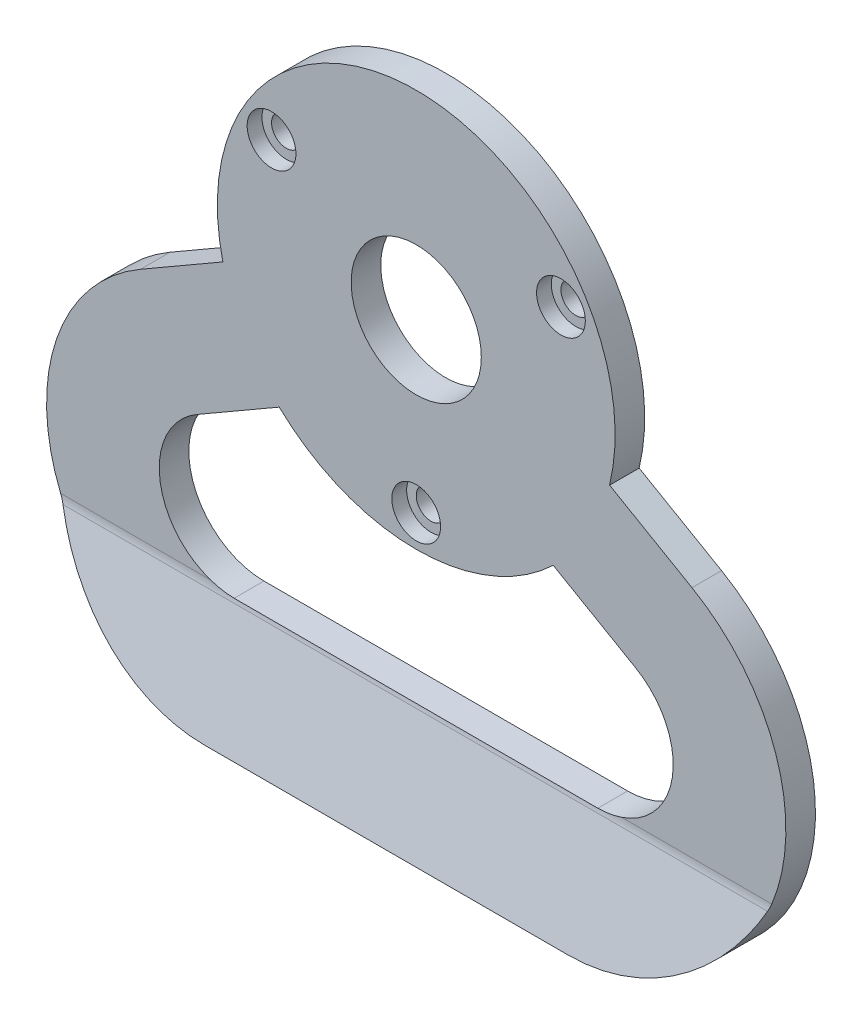
ISO-10303-21;
HEADER;
FILE_DESCRIPTION(('STEP AP214'),'2;1');
FILE_NAME('part.step','',(''),(''),'','','');
FILE_SCHEMA(('AUTOMOTIVE_DESIGN { 1 0 10303 214 1 1 1 1 }'));
ENDSEC;
DATA;
#1=APPLICATION_CONTEXT('core data for automotive mechanical design processes');
#2=APPLICATION_PROTOCOL_DEFINITION('international standard','automotive_design',2000,#1);
#3=PRODUCT_CONTEXT('',#1,'mechanical');
#4=PRODUCT('Part','Part','',(#3));
#5=PRODUCT_RELATED_PRODUCT_CATEGORY('part','',(#4));
#6=PRODUCT_DEFINITION_FORMATION('','',#4);
#7=PRODUCT_DEFINITION_CONTEXT('part definition',#1,'design');
#8=PRODUCT_DEFINITION('design','',#6,#7);
#9=PRODUCT_DEFINITION_SHAPE('','',#8);
#10=(LENGTH_UNIT() NAMED_UNIT(*) SI_UNIT(.MILLI.,.METRE.));
#11=(NAMED_UNIT(*) PLANE_ANGLE_UNIT() SI_UNIT($,.RADIAN.));
#12=(NAMED_UNIT(*) SI_UNIT($,.STERADIAN.) SOLID_ANGLE_UNIT());
#13=UNCERTAINTY_MEASURE_WITH_UNIT(LENGTH_MEASURE(1.E-05),#10,'distance_accuracy_value','');
#14=(GEOMETRIC_REPRESENTATION_CONTEXT(3) GLOBAL_UNCERTAINTY_ASSIGNED_CONTEXT((#13)) GLOBAL_UNIT_ASSIGNED_CONTEXT((#10,
#11,#12)) REPRESENTATION_CONTEXT('',''));
#15=CARTESIAN_POINT('',(0.,0.,0.));
#16=DIRECTION('',(0.,0.,1.));
#17=DIRECTION('',(1.,0.,0.));
#18=AXIS2_PLACEMENT_3D('',#15,#16,#17);
#19=CARTESIAN_POINT('',(0.,-75.1775588832577,5.));
#20=DIRECTION('',(0.,1.,0.));
#21=DIRECTION('',(0.,0.,1.));
#22=AXIS2_PLACEMENT_3D('',#19,#20,#21);
#23=PLANE('',#22);
#24=DIRECTION('',(0.,0.,-1.));
#25=VECTOR('',#24,1.);
#26=CARTESIAN_POINT('',(30.7422046406712,-75.1775588832577,5.));
#27=LINE('',#26,#25);
#28=CARTESIAN_POINT('',(30.7422046406712,-75.1775588832576,10.));
#29=VERTEX_POINT('',#28);
#30=CARTESIAN_POINT('',(30.7422046406712,-75.1775588832577,0.));
#31=VERTEX_POINT('',#30);
#32=EDGE_CURVE('E149',#29,#31,#27,.T.);
#33=ORIENTED_EDGE('',*,*,#32,.F.);
#34=DIRECTION('',(1.,0.,0.));
#35=VECTOR('',#34,1.);
#36=CARTESIAN_POINT('',(-62.5,-75.1775588832576,10.));
#37=LINE('',#36,#35);
#38=CARTESIAN_POINT('',(-30.7422046406712,-75.1775588832576,10.));
#39=VERTEX_POINT('',#38);
#40=EDGE_CURVE('E162',#39,#29,#37,.T.);
#41=ORIENTED_EDGE('',*,*,#40,.F.);
#42=DIRECTION('',(0.,0.,-1.));
#43=VECTOR('',#42,1.);
#44=CARTESIAN_POINT('',(-30.7422046406712,-75.1775588832576,5.));
#45=LINE('',#44,#43);
#46=CARTESIAN_POINT('',(-30.7422046406712,-75.1775588832576,0.));
#47=VERTEX_POINT('',#46);
#48=EDGE_CURVE('E192',#39,#47,#45,.T.);
#49=ORIENTED_EDGE('',*,*,#48,.T.);
#50=DIRECTION('',(1.,0.,0.));
#51=VECTOR('',#50,1.);
#52=CARTESIAN_POINT('',(0.,-75.1775588832577,0.));
#53=LINE('',#52,#51);
#54=EDGE_CURVE('E164',#47,#31,#53,.T.);
#55=ORIENTED_EDGE('',*,*,#54,.T.);
#56=EDGE_LOOP('',(#33,#41,#49,#55));
#57=FACE_BOUND('',#56,.T.);
#58=ADVANCED_FACE('F33',(#57),#23,.F.);
#59=CARTESIAN_POINT('',(0.,0.,5.));
#60=DIRECTION('',(0.,0.,1.));
#61=DIRECTION('',(1.,0.,0.));
#62=AXIS2_PLACEMENT_3D('',#59,#60,#61);
#63=PLANE('',#62);
#64=CARTESIAN_POINT('',(0.,0.,5.));
#65=DIRECTION('',(0.,0.,1.));
#66=DIRECTION('',(1.,0.,0.));
#67=AXIS2_PLACEMENT_3D('',#64,#65,#66);
#68=CIRCLE('',#67,11.);
#69=CARTESIAN_POINT('',(11.,0.,5.));
#70=VERTEX_POINT('',#69);
#71=EDGE_CURVE('E267',#70,#70,#68,.T.);
#72=ORIENTED_EDGE('',*,*,#71,.F.);
#73=EDGE_LOOP('',(#72));
#74=FACE_BOUND('',#73,.T.);
#75=CARTESIAN_POINT('',(-24.4652176569104,14.1249999999999,5.));
#76=DIRECTION('',(0.,0.,1.));
#77=DIRECTION('',(1.,0.,0.));
#78=AXIS2_PLACEMENT_3D('',#75,#76,#77);
#79=CIRCLE('',#78,4.125);
#80=CARTESIAN_POINT('',(-20.3402176569104,14.1249999999999,5.));
#81=VERTEX_POINT('',#80);
#82=EDGE_CURVE('E242',#81,#81,#79,.T.);
#83=ORIENTED_EDGE('',*,*,#82,.F.);
#84=EDGE_LOOP('',(#83));
#85=FACE_BOUND('',#84,.T.);
#86=CARTESIAN_POINT('',(24.4652176569103,14.1250000000001,5.));
#87=DIRECTION('',(0.,0.,1.));
#88=DIRECTION('',(1.,0.,0.));
#89=AXIS2_PLACEMENT_3D('',#86,#87,#88);
#90=CIRCLE('',#89,4.125);
#91=CARTESIAN_POINT('',(28.5902176569103,14.1250000000001,5.));
#92=VERTEX_POINT('',#91);
#93=EDGE_CURVE('E248',#92,#92,#90,.T.);
#94=ORIENTED_EDGE('',*,*,#93,.F.);
#95=EDGE_LOOP('',(#94));
#96=FACE_BOUND('',#95,.T.);
#97=CARTESIAN_POINT('',(0.,-28.25,5.));
#98=DIRECTION('',(0.,0.,1.));
#99=DIRECTION('',(1.,0.,0.));
#100=AXIS2_PLACEMENT_3D('',#97,#98,#99);
#101=CIRCLE('',#100,4.125);
#102=CARTESIAN_POINT('',(4.125,-28.25,5.));
#103=VERTEX_POINT('',#102);
#104=EDGE_CURVE('E237',#103,#103,#101,.T.);
#105=ORIENTED_EDGE('',*,*,#104,.F.);
#106=EDGE_LOOP('',(#105));
#107=FACE_BOUND('',#106,.T.);
#108=CARTESIAN_POINT('',(-30.7422046406712,-43.4197635239289,5.));
#109=DIRECTION('',(0.,0.,1.));
#110=DIRECTION('',(1.,0.,0.));
#111=AXIS2_PLACEMENT_3D('',#108,#109,#110);
#112=CIRCLE('',#111,31.7577953593288);
#113=CARTESIAN_POINT('',(-46.6211023203356,-15.9167059745627,5.));
#114=VERTEX_POINT('',#113);
#115=CARTESIAN_POINT('',(-60.1209732052363,-55.4798432796655,5.));
#116=VERTEX_POINT('',#115);
#117=EDGE_CURVE('E224',#114,#116,#112,.T.);
#118=ORIENTED_EDGE('',*,*,#117,.T.);
#119=DIRECTION('',(1.,0.,0.));
#120=VECTOR('',#119,1.);
#121=CARTESIAN_POINT('',(-30.7422046406712,-55.4798432796655,5.));
#122=LINE('',#121,#120);
#123=CARTESIAN_POINT('',(-34.7393924268729,-55.4798432796655,5.));
#124=VERTEX_POINT('',#123);
#125=EDGE_CURVE('E292',#116,#124,#122,.T.);
#126=ORIENTED_EDGE('',*,*,#125,.T.);
#127=CARTESIAN_POINT('',(-30.7422046406712,-43.4197635239289,5.));
#128=DIRECTION('',(0.,0.,1.));
#129=DIRECTION('',(1.,0.,0.));
#130=AXIS2_PLACEMENT_3D('',#127,#128,#129);
#131=CIRCLE('',#130,12.7052364760711);
#132=CARTESIAN_POINT('',(-37.0948228787067,-32.4167059745627,5.));
#133=VERTEX_POINT('',#132);
#134=EDGE_CURVE('E187',#133,#124,#131,.T.);
#135=ORIENTED_EDGE('',*,*,#134,.F.);
#136=DIRECTION('',(0.86602540378444,0.499999999999998,0.));
#137=VECTOR('',#136,1.);
#138=CARTESIAN_POINT('',(4.7631397208144,-8.25000000000002,5.));
#139=LINE('',#138,#137);
#140=CARTESIAN_POINT('',(-23.1638717331526,-24.3736675806095,5.));
#141=VERTEX_POINT('',#140);
#142=EDGE_CURVE('E228',#133,#141,#139,.T.);
#143=ORIENTED_EDGE('',*,*,#142,.T.);
#144=CARTESIAN_POINT('',(0.,0.,5.));
#145=DIRECTION('',(0.,0.,1.));
#146=DIRECTION('',(1.,0.,0.));
#147=AXIS2_PLACEMENT_3D('',#144,#145,#146);
#148=CIRCLE('',#147,33.625);
#149=CARTESIAN_POINT('',(23.1638717331526,-24.3736675806095,5.));
#150=VERTEX_POINT('',#149);
#151=EDGE_CURVE('E273',#141,#150,#148,.T.);
#152=ORIENTED_EDGE('',*,*,#151,.T.);
#153=DIRECTION('',(0.86602540378444,-0.499999999999998,0.));
#154=VECTOR('',#153,1.);
#155=CARTESIAN_POINT('',(-4.7631397208144,-8.25000000000003,5.));
#156=LINE('',#155,#154);
#157=CARTESIAN_POINT('',(37.0948228787068,-32.4167059745627,5.));
#158=VERTEX_POINT('',#157);
#159=EDGE_CURVE('E198',#150,#158,#156,.T.);
#160=ORIENTED_EDGE('',*,*,#159,.T.);
#161=CARTESIAN_POINT('',(30.7422046406712,-43.4197635239289,5.));
#162=DIRECTION('',(0.,0.,1.));
#163=DIRECTION('',(1.,0.,0.));
#164=AXIS2_PLACEMENT_3D('',#161,#162,#163);
#165=CIRCLE('',#164,12.7052364760711);
#166=CARTESIAN_POINT('',(34.7393924268729,-55.4798432796655,5.));
#167=VERTEX_POINT('',#166);
#168=EDGE_CURVE('E175',#167,#158,#165,.T.);
#169=ORIENTED_EDGE('',*,*,#168,.F.);
#170=DIRECTION('',(-1.,0.,0.));
#171=VECTOR('',#170,1.);
#172=CARTESIAN_POINT('',(47.4301828160546,-55.4798432796655,5.));
#173=LINE('',#172,#171);
#174=CARTESIAN_POINT('',(60.1209732052363,-55.4798432796655,5.));
#175=VERTEX_POINT('',#174);
#176=EDGE_CURVE('E156',#167,#175,#173,.F.);
#177=ORIENTED_EDGE('',*,*,#176,.T.);
#178=CARTESIAN_POINT('',(30.7422046406712,-43.4197635239289,5.));
#179=DIRECTION('',(0.,0.,1.));
#180=DIRECTION('',(1.,0.,0.));
#181=AXIS2_PLACEMENT_3D('',#178,#179,#180);
#182=CIRCLE('',#181,31.7577953593288);
#183=CARTESIAN_POINT('',(46.6211023203355,-15.9167059745626,5.));
#184=VERTEX_POINT('',#183);
#185=EDGE_CURVE('E201',#175,#184,#182,.T.);
#186=ORIENTED_EDGE('',*,*,#185,.T.);
#187=DIRECTION('',(0.86602540378444,-0.499999999999998,0.));
#188=VECTOR('',#187,1.);
#189=CARTESIAN_POINT('',(4.7631397208144,8.25000000000003,5.));
#190=LINE('',#189,#188);
#191=CARTESIAN_POINT('',(32.6901511747813,-7.87366758060945,5.));
#192=VERTEX_POINT('',#191);
#193=EDGE_CURVE('E204',#192,#184,#190,.T.);
#194=ORIENTED_EDGE('',*,*,#193,.F.);
#195=CARTESIAN_POINT('',(-32.6901511747813,-7.87366758060957,5.));
#196=VERTEX_POINT('',#195);
#197=EDGE_CURVE('E277',#192,#196,#148,.T.);
#198=ORIENTED_EDGE('',*,*,#197,.T.);
#199=DIRECTION('',(-0.866025403784439,-0.5,0.));
#200=VECTOR('',#199,1.);
#201=CARTESIAN_POINT('',(-4.76313972081441,8.25,5.));
#202=LINE('',#201,#200);
#203=EDGE_CURVE('E222',#196,#114,#202,.T.);
#204=ORIENTED_EDGE('',*,*,#203,.T.);
#205=EDGE_LOOP('',(#118,#126,#135,#143,#152,#160,#169,#177,#186,#194,#198,#204));
#206=FACE_BOUND('',#205,.T.);
#207=ADVANCED_FACE('F341',(#74,#85,#96,#107,#206),#63,.T.);
#208=CARTESIAN_POINT('',(4.7631397208144,-8.25000000000002,5.));
#209=DIRECTION('',(-0.499999999999998,0.86602540378444,0.));
#210=DIRECTION('',(-0.86602540378444,-0.499999999999998,0.));
#211=AXIS2_PLACEMENT_3D('',#208,#209,#210);
#212=PLANE('',#211);
#213=DIRECTION('',(0.,0.,-1.));
#214=VECTOR('',#213,1.);
#215=CARTESIAN_POINT('',(-37.0948228787067,-32.4167059745627,5.));
#216=LINE('',#215,#214);
#217=CARTESIAN_POINT('',(-37.0948228787067,-32.4167059745627,0.));
#218=VERTEX_POINT('',#217);
#219=EDGE_CURVE('E194',#133,#218,#216,.T.);
#220=ORIENTED_EDGE('',*,*,#219,.T.);
#221=DIRECTION('',(0.86602540378444,0.499999999999998,0.));
#222=VECTOR('',#221,1.);
#223=CARTESIAN_POINT('',(4.7631397208144,-8.25000000000002,0.));
#224=LINE('',#223,#222);
#225=CARTESIAN_POINT('',(-23.1638717331526,-24.3736675806095,0.));
#226=VERTEX_POINT('',#225);
#227=EDGE_CURVE('E225',#218,#226,#224,.T.);
#228=ORIENTED_EDGE('',*,*,#227,.T.);
#229=DIRECTION('',(0.,0.,-1.));
#230=VECTOR('',#229,1.);
#231=CARTESIAN_POINT('',(-23.1638717331526,-24.3736675806095,5.));
#232=LINE('',#231,#230);
#233=EDGE_CURVE('E276',#226,#141,#232,.F.);
#234=ORIENTED_EDGE('',*,*,#233,.T.);
#235=ORIENTED_EDGE('',*,*,#142,.F.);
#236=EDGE_LOOP('',(#220,#228,#234,#235));
#237=FACE_BOUND('',#236,.T.);
#238=ADVANCED_FACE('F345',(#237),#212,.F.);
#239=CARTESIAN_POINT('',(0.,0.,5.));
#240=DIRECTION('',(0.,0.,-1.));
#241=DIRECTION('',(-1.,0.,0.));
#242=AXIS2_PLACEMENT_3D('',#239,#240,#241);
#243=CYLINDRICAL_SURFACE('',#242,33.625);
#244=DIRECTION('',(0.,0.,-1.));
#245=VECTOR('',#244,1.);
#246=CARTESIAN_POINT('',(23.1638717331526,-24.3736675806095,5.));
#247=LINE('',#246,#245);
#248=CARTESIAN_POINT('',(23.1638717331526,-24.3736675806095,0.));
#249=VERTEX_POINT('',#248);
#250=EDGE_CURVE('E218',#150,#249,#247,.T.);
#251=ORIENTED_EDGE('',*,*,#250,.F.);
#252=ORIENTED_EDGE('',*,*,#151,.F.);
#253=ORIENTED_EDGE('',*,*,#233,.F.);
#254=CARTESIAN_POINT('',(0.,0.,0.));
#255=DIRECTION('',(0.,0.,1.));
#256=DIRECTION('',(1.,0.,0.));
#257=AXIS2_PLACEMENT_3D('',#254,#255,#256);
#258=CIRCLE('',#257,33.625);
#259=EDGE_CURVE('E278',#226,#249,#258,.T.);
#260=ORIENTED_EDGE('',*,*,#259,.T.);
#261=EDGE_LOOP('',(#251,#252,#253,#260));
#262=FACE_BOUND('',#261,.T.);
#263=ADVANCED_FACE('F351',(#262),#243,.T.);
#264=ORIENTED_EDGE('',*,*,#197,.F.);
#265=DIRECTION('',(0.,0.,-1.));
#266=VECTOR('',#265,1.);
#267=CARTESIAN_POINT('',(32.6901511747813,-7.87366758060945,5.));
#268=LINE('',#267,#266);
#269=CARTESIAN_POINT('',(32.6901511747813,-7.87366758060945,0.));
#270=VERTEX_POINT('',#269);
#271=EDGE_CURVE('E215',#192,#270,#268,.T.);
#272=ORIENTED_EDGE('',*,*,#271,.T.);
#273=CARTESIAN_POINT('',(-32.6901511747813,-7.87366758060957,0.));
#274=VERTEX_POINT('',#273);
#275=EDGE_CURVE('E270',#270,#274,#258,.T.);
#276=ORIENTED_EDGE('',*,*,#275,.T.);
#277=DIRECTION('',(0.,0.,-1.));
#278=VECTOR('',#277,1.);
#279=CARTESIAN_POINT('',(-32.6901511747813,-7.87366758060957,5.));
#280=LINE('',#279,#278);
#281=EDGE_CURVE('E157',#196,#274,#280,.T.);
#282=ORIENTED_EDGE('',*,*,#281,.F.);
#283=EDGE_LOOP('',(#264,#272,#276,#282));
#284=FACE_BOUND('',#283,.T.);
#285=ADVANCED_FACE('F363',(#284),#243,.T.);
#286=CARTESIAN_POINT('',(-24.4652176569104,14.1249999999999,5.));
#287=DIRECTION('',(0.,0.,-1.));
#288=DIRECTION('',(-1.,0.,0.));
#289=AXIS2_PLACEMENT_3D('',#286,#287,#288);
#290=CYLINDRICAL_SURFACE('',#289,2.50000000000001);
#291=CARTESIAN_POINT('',(-24.4652176569104,14.1249999999999,0.));
#292=DIRECTION('',(0.,0.,1.));
#293=DIRECTION('',(1.,0.,0.));
#294=AXIS2_PLACEMENT_3D('',#291,#292,#293);
#295=CIRCLE('',#294,2.50000000000001);
#296=CARTESIAN_POINT('',(-21.9652176569104,14.1249999999999,0.));
#297=VERTEX_POINT('',#296);
#298=EDGE_CURVE('E263',#297,#297,#295,.T.);
#299=ORIENTED_EDGE('',*,*,#298,.F.);
#300=EDGE_LOOP('',(#299));
#301=FACE_BOUND('',#300,.T.);
#302=CARTESIAN_POINT('',(-24.4652176569104,14.1249999999999,2.5));
#303=DIRECTION('',(0.,0.,1.));
#304=DIRECTION('',(1.,0.,0.));
#305=AXIS2_PLACEMENT_3D('',#302,#303,#304);
#306=CIRCLE('',#305,2.50000000000001);
#307=CARTESIAN_POINT('',(-21.9652176569104,14.1249999999999,2.5));
#308=VERTEX_POINT('',#307);
#309=EDGE_CURVE('E260',#308,#308,#306,.T.);
#310=ORIENTED_EDGE('',*,*,#309,.T.);
#311=EDGE_LOOP('',(#310));
#312=FACE_BOUND('',#311,.T.);
#313=ADVANCED_FACE('F365',(#301,#312),#290,.F.);
#314=CARTESIAN_POINT('',(24.4652176569103,14.1250000000001,5.));
#315=DIRECTION('',(0.,0.,-1.));
#316=DIRECTION('',(-1.,0.,0.));
#317=AXIS2_PLACEMENT_3D('',#314,#315,#316);
#318=CYLINDRICAL_SURFACE('',#317,2.5);
#319=CARTESIAN_POINT('',(24.4652176569103,14.1250000000001,0.));
#320=DIRECTION('',(0.,0.,1.));
#321=DIRECTION('',(1.,0.,0.));
#322=AXIS2_PLACEMENT_3D('',#319,#320,#321);
#323=CIRCLE('',#322,2.5);
#324=CARTESIAN_POINT('',(26.9652176569103,14.1250000000001,0.));
#325=VERTEX_POINT('',#324);
#326=EDGE_CURVE('E259',#325,#325,#323,.T.);
#327=ORIENTED_EDGE('',*,*,#326,.F.);
#328=EDGE_LOOP('',(#327));
#329=FACE_BOUND('',#328,.T.);
#330=CARTESIAN_POINT('',(24.4652176569103,14.1250000000001,2.5));
#331=DIRECTION('',(0.,0.,1.));
#332=DIRECTION('',(1.,0.,0.));
#333=AXIS2_PLACEMENT_3D('',#330,#331,#332);
#334=CIRCLE('',#333,2.5);
#335=CARTESIAN_POINT('',(26.9652176569103,14.1250000000001,2.5));
#336=VERTEX_POINT('',#335);
#337=EDGE_CURVE('E282',#336,#336,#334,.T.);
#338=ORIENTED_EDGE('',*,*,#337,.T.);
#339=EDGE_LOOP('',(#338));
#340=FACE_BOUND('',#339,.T.);
#341=ADVANCED_FACE('F371',(#329,#340),#318,.F.);
#342=CARTESIAN_POINT('',(0.,-28.25,5.));
#343=DIRECTION('',(0.,0.,-1.));
#344=DIRECTION('',(-1.,0.,0.));
#345=AXIS2_PLACEMENT_3D('',#342,#343,#344);
#346=CYLINDRICAL_SURFACE('',#345,2.5);
#347=CARTESIAN_POINT('',(0.,-28.25,0.));
#348=DIRECTION('',(0.,0.,1.));
#349=DIRECTION('',(1.,0.,0.));
#350=AXIS2_PLACEMENT_3D('',#347,#348,#349);
#351=CIRCLE('',#350,2.5);
#352=CARTESIAN_POINT('',(2.50000000000001,-28.25,0.));
#353=VERTEX_POINT('',#352);
#354=EDGE_CURVE('E256',#353,#353,#351,.T.);
#355=ORIENTED_EDGE('',*,*,#354,.F.);
#356=EDGE_LOOP('',(#355));
#357=FACE_BOUND('',#356,.T.);
#358=CARTESIAN_POINT('',(0.,-28.25,2.5));
#359=DIRECTION('',(0.,0.,1.));
#360=DIRECTION('',(1.,0.,0.));
#361=AXIS2_PLACEMENT_3D('',#358,#359,#360);
#362=CIRCLE('',#361,2.5);
#363=CARTESIAN_POINT('',(2.50000000000001,-28.25,2.5));
#364=VERTEX_POINT('',#363);
#365=EDGE_CURVE('E241',#364,#364,#362,.T.);
#366=ORIENTED_EDGE('',*,*,#365,.T.);
#367=EDGE_LOOP('',(#366));
#368=FACE_BOUND('',#367,.T.);
#369=ADVANCED_FACE('F361',(#357,#368),#346,.F.);
#370=CARTESIAN_POINT('',(0.,0.,0.));
#371=DIRECTION('',(0.,0.,1.));
#372=DIRECTION('',(1.,0.,0.));
#373=AXIS2_PLACEMENT_3D('',#370,#371,#372);
#374=PLANE('',#373);
#375=CARTESIAN_POINT('',(30.7422046406712,-43.4197635239289,0.));
#376=DIRECTION('',(0.,0.,1.));
#377=DIRECTION('',(1.,0.,0.));
#378=AXIS2_PLACEMENT_3D('',#375,#376,#377);
#379=CIRCLE('',#378,31.7577953593288);
#380=CARTESIAN_POINT('',(46.6211023203355,-15.9167059745626,0.));
#381=VERTEX_POINT('',#380);
#382=EDGE_CURVE('E209',#31,#381,#379,.T.);
#383=ORIENTED_EDGE('',*,*,#382,.F.);
#384=ORIENTED_EDGE('',*,*,#54,.F.);
#385=CARTESIAN_POINT('',(-30.7422046406712,-43.4197635239289,0.));
#386=DIRECTION('',(0.,0.,1.));
#387=DIRECTION('',(1.,0.,0.));
#388=AXIS2_PLACEMENT_3D('',#385,#386,#387);
#389=CIRCLE('',#388,31.7577953593288);
#390=CARTESIAN_POINT('',(-46.6211023203356,-15.9167059745627,0.));
#391=VERTEX_POINT('',#390);
#392=EDGE_CURVE('E232',#391,#47,#389,.T.);
#393=ORIENTED_EDGE('',*,*,#392,.F.);
#394=DIRECTION('',(-0.866025403784439,-0.5,0.));
#395=VECTOR('',#394,1.);
#396=CARTESIAN_POINT('',(-4.76313972081441,8.25,0.));
#397=LINE('',#396,#395);
#398=EDGE_CURVE('E221',#274,#391,#397,.T.);
#399=ORIENTED_EDGE('',*,*,#398,.F.);
#400=ORIENTED_EDGE('',*,*,#275,.F.);
#401=DIRECTION('',(0.86602540378444,-0.499999999999998,0.));
#402=VECTOR('',#401,1.);
#403=CARTESIAN_POINT('',(4.7631397208144,8.25000000000003,0.));
#404=LINE('',#403,#402);
#405=EDGE_CURVE('E202',#270,#381,#404,.T.);
#406=ORIENTED_EDGE('',*,*,#405,.T.);
#407=EDGE_LOOP('',(#383,#384,#393,#399,#400,#406));
#408=FACE_BOUND('',#407,.T.);
#409=DIRECTION('',(1.,0.,0.));
#410=VECTOR('',#409,1.);
#411=CARTESIAN_POINT('',(0.,-56.125,0.));
#412=LINE('',#411,#410);
#413=CARTESIAN_POINT('',(-30.7422046406712,-56.125,0.));
#414=VERTEX_POINT('',#413);
#415=CARTESIAN_POINT('',(30.7422046406712,-56.125,0.));
#416=VERTEX_POINT('',#415);
#417=EDGE_CURVE('E166',#414,#416,#412,.T.);
#418=ORIENTED_EDGE('',*,*,#417,.T.);
#419=CARTESIAN_POINT('',(30.7422046406712,-43.4197635239289,0.));
#420=DIRECTION('',(0.,0.,1.));
#421=DIRECTION('',(1.,0.,0.));
#422=AXIS2_PLACEMENT_3D('',#419,#420,#421);
#423=CIRCLE('',#422,12.7052364760711);
#424=CARTESIAN_POINT('',(37.0948228787067,-32.4167059745627,0.));
#425=VERTEX_POINT('',#424);
#426=EDGE_CURVE('E172',#416,#425,#423,.T.);
#427=ORIENTED_EDGE('',*,*,#426,.T.);
#428=DIRECTION('',(0.86602540378444,-0.499999999999998,0.));
#429=VECTOR('',#428,1.);
#430=CARTESIAN_POINT('',(-4.7631397208144,-8.25000000000003,0.));
#431=LINE('',#430,#429);
#432=EDGE_CURVE('E197',#249,#425,#431,.T.);
#433=ORIENTED_EDGE('',*,*,#432,.F.);
#434=ORIENTED_EDGE('',*,*,#259,.F.);
#435=ORIENTED_EDGE('',*,*,#227,.F.);
#436=CARTESIAN_POINT('',(-30.7422046406712,-43.4197635239289,0.));
#437=DIRECTION('',(0.,0.,1.));
#438=DIRECTION('',(1.,0.,0.));
#439=AXIS2_PLACEMENT_3D('',#436,#437,#438);
#440=CIRCLE('',#439,12.7052364760711);
#441=EDGE_CURVE('E165',#218,#414,#440,.T.);
#442=ORIENTED_EDGE('',*,*,#441,.T.);
#443=EDGE_LOOP('',(#418,#427,#433,#434,#435,#442));
#444=FACE_BOUND('',#443,.T.);
#445=ORIENTED_EDGE('',*,*,#354,.T.);
#446=EDGE_LOOP('',(#445));
#447=FACE_BOUND('',#446,.T.);
#448=ORIENTED_EDGE('',*,*,#326,.T.);
#449=EDGE_LOOP('',(#448));
#450=FACE_BOUND('',#449,.T.);
#451=ORIENTED_EDGE('',*,*,#298,.T.);
#452=EDGE_LOOP('',(#451));
#453=FACE_BOUND('',#452,.T.);
#454=CARTESIAN_POINT('',(0.,0.,0.));
#455=DIRECTION('',(0.,0.,1.));
#456=DIRECTION('',(1.,0.,0.));
#457=AXIS2_PLACEMENT_3D('',#454,#455,#456);
#458=CIRCLE('',#457,11.);
#459=CARTESIAN_POINT('',(11.,0.,0.));
#460=VERTEX_POINT('',#459);
#461=EDGE_CURVE('E266',#460,#460,#458,.T.);
#462=ORIENTED_EDGE('',*,*,#461,.T.);
#463=EDGE_LOOP('',(#462));
#464=FACE_BOUND('',#463,.T.);
#465=ADVANCED_FACE('F359',(#408,#444,#447,#450,#453,#464),#374,.F.);
#466=CARTESIAN_POINT('',(0.,0.,5.));
#467=DIRECTION('',(0.,0.,-1.));
#468=DIRECTION('',(-1.,0.,0.));
#469=AXIS2_PLACEMENT_3D('',#466,#467,#468);
#470=CYLINDRICAL_SURFACE('',#469,11.);
#471=ORIENTED_EDGE('',*,*,#71,.T.);
#472=EDGE_LOOP('',(#471));
#473=FACE_BOUND('',#472,.T.);
#474=ORIENTED_EDGE('',*,*,#461,.F.);
#475=EDGE_LOOP('',(#474));
#476=FACE_BOUND('',#475,.T.);
#477=ADVANCED_FACE('F357',(#473,#476),#470,.F.);
#478=CARTESIAN_POINT('',(0.,-28.25,2.5));
#479=DIRECTION('',(0.,0.,1.));
#480=DIRECTION('',(1.,0.,0.));
#481=AXIS2_PLACEMENT_3D('',#478,#479,#480);
#482=CYLINDRICAL_SURFACE('',#481,4.125);
#483=CARTESIAN_POINT('',(0.,-28.25,2.5));
#484=DIRECTION('',(0.,0.,1.));
#485=DIRECTION('',(1.,0.,0.));
#486=AXIS2_PLACEMENT_3D('',#483,#484,#485);
#487=CIRCLE('',#486,4.125);
#488=CARTESIAN_POINT('',(4.125,-28.25,2.5));
#489=VERTEX_POINT('',#488);
#490=EDGE_CURVE('E251',#489,#489,#487,.T.);
#491=ORIENTED_EDGE('',*,*,#490,.F.);
#492=EDGE_LOOP('',(#491));
#493=FACE_BOUND('',#492,.T.);
#494=ORIENTED_EDGE('',*,*,#104,.T.);
#495=EDGE_LOOP('',(#494));
#496=FACE_BOUND('',#495,.T.);
#497=ADVANCED_FACE('F437',(#493,#496),#482,.F.);
#498=CARTESIAN_POINT('',(0.,-28.25,2.5));
#499=DIRECTION('',(0.,0.,1.));
#500=DIRECTION('',(1.,0.,0.));
#501=AXIS2_PLACEMENT_3D('',#498,#499,#500);
#502=PLANE('',#501);
#503=ORIENTED_EDGE('',*,*,#365,.F.);
#504=EDGE_LOOP('',(#503));
#505=FACE_BOUND('',#504,.T.);
#506=ORIENTED_EDGE('',*,*,#490,.T.);
#507=EDGE_LOOP('',(#506));
#508=FACE_BOUND('',#507,.T.);
#509=ADVANCED_FACE('F433',(#505,#508),#502,.T.);
#510=CARTESIAN_POINT('',(24.4652176569103,14.1250000000001,2.5));
#511=DIRECTION('',(0.,0.,1.));
#512=DIRECTION('',(1.,0.,0.));
#513=AXIS2_PLACEMENT_3D('',#510,#511,#512);
#514=CYLINDRICAL_SURFACE('',#513,4.125);
#515=CARTESIAN_POINT('',(24.4652176569103,14.1250000000001,2.5));
#516=DIRECTION('',(0.,0.,1.));
#517=DIRECTION('',(1.,0.,0.));
#518=AXIS2_PLACEMENT_3D('',#515,#516,#517);
#519=CIRCLE('',#518,4.125);
#520=CARTESIAN_POINT('',(28.5902176569103,14.1250000000001,2.5));
#521=VERTEX_POINT('',#520);
#522=EDGE_CURVE('E245',#521,#521,#519,.T.);
#523=ORIENTED_EDGE('',*,*,#522,.F.);
#524=EDGE_LOOP('',(#523));
#525=FACE_BOUND('',#524,.T.);
#526=ORIENTED_EDGE('',*,*,#93,.T.);
#527=EDGE_LOOP('',(#526));
#528=FACE_BOUND('',#527,.T.);
#529=ADVANCED_FACE('F429',(#525,#528),#514,.F.);
#530=CARTESIAN_POINT('',(24.4652176569103,14.1250000000001,2.5));
#531=DIRECTION('',(0.,0.,1.));
#532=DIRECTION('',(1.,0.,0.));
#533=AXIS2_PLACEMENT_3D('',#530,#531,#532);
#534=PLANE('',#533);
#535=ORIENTED_EDGE('',*,*,#337,.F.);
#536=EDGE_LOOP('',(#535));
#537=FACE_BOUND('',#536,.T.);
#538=ORIENTED_EDGE('',*,*,#522,.T.);
#539=EDGE_LOOP('',(#538));
#540=FACE_BOUND('',#539,.T.);
#541=ADVANCED_FACE('F425',(#537,#540),#534,.T.);
#542=CARTESIAN_POINT('',(-24.4652176569104,14.1249999999999,2.5));
#543=DIRECTION('',(0.,0.,1.));
#544=DIRECTION('',(1.,0.,0.));
#545=AXIS2_PLACEMENT_3D('',#542,#543,#544);
#546=CYLINDRICAL_SURFACE('',#545,4.125);
#547=CARTESIAN_POINT('',(-24.4652176569104,14.1249999999999,2.5));
#548=DIRECTION('',(0.,0.,1.));
#549=DIRECTION('',(1.,0.,0.));
#550=AXIS2_PLACEMENT_3D('',#547,#548,#549);
#551=CIRCLE('',#550,4.125);
#552=CARTESIAN_POINT('',(-20.3402176569104,14.1249999999999,2.5));
#553=VERTEX_POINT('',#552);
#554=EDGE_CURVE('E238',#553,#553,#551,.T.);
#555=ORIENTED_EDGE('',*,*,#554,.F.);
#556=EDGE_LOOP('',(#555));
#557=FACE_BOUND('',#556,.T.);
#558=ORIENTED_EDGE('',*,*,#82,.T.);
#559=EDGE_LOOP('',(#558));
#560=FACE_BOUND('',#559,.T.);
#561=ADVANCED_FACE('F421',(#557,#560),#546,.F.);
#562=CARTESIAN_POINT('',(-24.4652176569104,14.1249999999999,2.5));
#563=DIRECTION('',(0.,0.,1.));
#564=DIRECTION('',(1.,0.,0.));
#565=AXIS2_PLACEMENT_3D('',#562,#563,#564);
#566=PLANE('',#565);
#567=ORIENTED_EDGE('',*,*,#309,.F.);
#568=EDGE_LOOP('',(#567));
#569=FACE_BOUND('',#568,.T.);
#570=ORIENTED_EDGE('',*,*,#554,.T.);
#571=EDGE_LOOP('',(#570));
#572=FACE_BOUND('',#571,.T.);
#573=ADVANCED_FACE('F415',(#569,#572),#566,.T.);
#574=CARTESIAN_POINT('',(-4.76313972081441,8.25,5.));
#575=DIRECTION('',(0.5,-0.866025403784438,0.));
#576=DIRECTION('',(0.866025403784438,0.5,0.));
#577=AXIS2_PLACEMENT_3D('',#574,#575,#576);
#578=PLANE('',#577);
#579=ORIENTED_EDGE('',*,*,#203,.F.);
#580=ORIENTED_EDGE('',*,*,#281,.T.);
#581=ORIENTED_EDGE('',*,*,#398,.T.);
#582=DIRECTION('',(0.,0.,-1.));
#583=VECTOR('',#582,1.);
#584=CARTESIAN_POINT('',(-46.6211023203356,-15.9167059745627,5.));
#585=LINE('',#584,#583);
#586=EDGE_CURVE('E230',#114,#391,#585,.T.);
#587=ORIENTED_EDGE('',*,*,#586,.F.);
#588=EDGE_LOOP('',(#579,#580,#581,#587));
#589=FACE_BOUND('',#588,.T.);
#590=ADVANCED_FACE('F394',(#589),#578,.F.);
#591=CARTESIAN_POINT('',(-30.7422046406712,-43.4197635239289,5.));
#592=DIRECTION('',(0.,0.,-1.));
#593=DIRECTION('',(-1.,0.,0.));
#594=AXIS2_PLACEMENT_3D('',#591,#592,#593);
#595=CYLINDRICAL_SURFACE('',#594,31.7577953593288);
#596=ORIENTED_EDGE('',*,*,#48,.F.);
#597=CARTESIAN_POINT('',(-30.7422046406712,-43.4197635239289,1.66574013655567));
#598=DIRECTION('',(0.,0.253836541283405,0.967247129904906));
#599=DIRECTION('',(0.,0.967247129904906,-0.253836541283405));
#600=AXIS2_PLACEMENT_3D('',#597,#598,#599);
#601=ELLIPSE('',#600,32.8331761113119,31.7577953593287);
#602=CARTESIAN_POINT('',(-59.5673382622179,-56.7490259860825,5.16376435047547));
#603=VERTEX_POINT('',#602);
#604=EDGE_CURVE('E171',#39,#603,#601,.F.);
#605=ORIENTED_EDGE('',*,*,#604,.T.);
#606=CARTESIAN_POINT('',(-59.5673382622179,-56.7490259860825,5.16376435047547));
#607=CARTESIAN_POINT('',(-59.6149761954838,-56.6460131189256,5.13672923503533));
#608=CARTESIAN_POINT('',(-59.6623850307836,-56.5420334694172,5.11296100852098));
#609=CARTESIAN_POINT('',(-59.7563866222658,-56.3328526383885,5.07215178636115));
#610=CARTESIAN_POINT('',(-59.8029816619456,-56.2276570381824,5.05508742829317));
#611=CARTESIAN_POINT('',(-59.8953363493689,-56.0160250776643,5.02768738464942));
#612=CARTESIAN_POINT('',(-59.9410959818559,-55.9095886947506,5.01735182183908));
#613=CARTESIAN_POINT('',(-60.0317632272901,-55.6954686297556,5.0034950699628));
#614=CARTESIAN_POINT('',(-60.0766672636185,-55.5877818715148,4.99999805729691));
#615=CARTESIAN_POINT('',(-60.1209732052363,-55.4798432796655,5.));
#616=B_SPLINE_CURVE_WITH_KNOTS('',3,(#606,#607,#608,#609,#610,#611,#612,#613,#614,#615),
.UNSPECIFIED.,.F.,.F.,(4,2,2,2,4),(0.,0.349964977819084,0.698699302319832,1.04743998922562,
1.39741136974465),.UNSPECIFIED.);
#617=EDGE_CURVE('E11',#603,#116,#616,.T.);
#618=ORIENTED_EDGE('',*,*,#617,.T.);
#619=ORIENTED_EDGE('',*,*,#117,.F.);
#620=ORIENTED_EDGE('',*,*,#586,.T.);
#621=ORIENTED_EDGE('',*,*,#392,.T.);
#622=EDGE_LOOP('',(#596,#605,#618,#619,#620,#621));
#623=FACE_BOUND('',#622,.T.);
#624=ADVANCED_FACE('F388',(#623),#595,.T.);
#625=CARTESIAN_POINT('',(-4.7631397208144,-8.25000000000003,5.));
#626=DIRECTION('',(0.499999999999998,0.86602540378444,0.));
#627=DIRECTION('',(-0.86602540378444,0.499999999999998,0.));
#628=AXIS2_PLACEMENT_3D('',#625,#626,#627);
#629=PLANE('',#628);
#630=ORIENTED_EDGE('',*,*,#432,.T.);
#631=DIRECTION('',(0.,0.,-1.));
#632=VECTOR('',#631,1.);
#633=CARTESIAN_POINT('',(37.0948228787068,-32.4167059745627,5.));
#634=LINE('',#633,#632);
#635=EDGE_CURVE('E179',#158,#425,#634,.T.);
#636=ORIENTED_EDGE('',*,*,#635,.F.);
#637=ORIENTED_EDGE('',*,*,#159,.F.);
#638=ORIENTED_EDGE('',*,*,#250,.T.);
#639=EDGE_LOOP('',(#630,#636,#637,#638));
#640=FACE_BOUND('',#639,.T.);
#641=ADVANCED_FACE('F317',(#640),#629,.F.);
#642=CARTESIAN_POINT('',(4.7631397208144,8.25000000000003,5.));
#643=DIRECTION('',(0.499999999999998,0.86602540378444,0.));
#644=DIRECTION('',(-0.86602540378444,0.499999999999998,0.));
#645=AXIS2_PLACEMENT_3D('',#642,#643,#644);
#646=PLANE('',#645);
#647=ORIENTED_EDGE('',*,*,#271,.F.);
#648=ORIENTED_EDGE('',*,*,#193,.T.);
#649=DIRECTION('',(0.,0.,-1.));
#650=VECTOR('',#649,1.);
#651=CARTESIAN_POINT('',(46.6211023203355,-15.9167059745626,5.));
#652=LINE('',#651,#650);
#653=EDGE_CURVE('E207',#184,#381,#652,.T.);
#654=ORIENTED_EDGE('',*,*,#653,.T.);
#655=ORIENTED_EDGE('',*,*,#405,.F.);
#656=EDGE_LOOP('',(#647,#648,#654,#655));
#657=FACE_BOUND('',#656,.T.);
#658=ADVANCED_FACE('F314',(#657),#646,.T.);
#659=CARTESIAN_POINT('',(30.7422046406712,-43.4197635239289,5.));
#660=DIRECTION('',(0.,0.,-1.));
#661=DIRECTION('',(-1.,0.,0.));
#662=AXIS2_PLACEMENT_3D('',#659,#660,#661);
#663=CYLINDRICAL_SURFACE('',#662,31.7577953593288);
#664=ORIENTED_EDGE('',*,*,#382,.T.);
#665=ORIENTED_EDGE('',*,*,#653,.F.);
#666=ORIENTED_EDGE('',*,*,#185,.F.);
#667=CARTESIAN_POINT('',(60.1209732052363,-55.4798432796655,5.));
#668=CARTESIAN_POINT('',(60.0766672636186,-55.5877818715148,4.99999805729691));
#669=CARTESIAN_POINT('',(60.0317632272901,-55.6954686297556,5.0034950699628));
#670=CARTESIAN_POINT('',(59.9410959818559,-55.9095886947506,5.01735182183908));
#671=CARTESIAN_POINT('',(59.895336349369,-56.0160250776643,5.02768738464942));
#672=CARTESIAN_POINT('',(59.8029816619456,-56.2276570381823,5.05508742829317));
#673=CARTESIAN_POINT('',(59.7563866222658,-56.3328526383885,5.07215178636115));
#674=CARTESIAN_POINT('',(59.6623850307836,-56.5420334694172,5.11296100852098));
#675=CARTESIAN_POINT('',(59.6149761954839,-56.6460131189256,5.13672923503533));
#676=CARTESIAN_POINT('',(59.5673382622181,-56.7490259860825,5.16376435047547));
#677=B_SPLINE_CURVE_WITH_KNOTS('',3,(#667,#668,#669,#670,#671,#672,#673,#674,#675,#676),
.UNSPECIFIED.,.F.,.F.,(4,2,2,2,4),(0.,0.349971380519021,0.698712067424805,1.04744639192555,
1.39741136974463),.UNSPECIFIED.);
#678=CARTESIAN_POINT('',(59.567338262218,-56.7490259860825,5.16376435047547));
#679=VERTEX_POINT('',#678);
#680=EDGE_CURVE('E47',#175,#679,#677,.T.);
#681=ORIENTED_EDGE('',*,*,#680,.T.);
#682=CARTESIAN_POINT('',(30.7422046406712,-43.4197635239289,1.66574013655567));
#683=DIRECTION('',(0.,0.253836541283405,0.967247129904906));
#684=DIRECTION('',(0.,0.967247129904906,-0.253836541283405));
#685=AXIS2_PLACEMENT_3D('',#682,#683,#684);
#686=ELLIPSE('',#685,32.8331761113119,31.7577953593288);
#687=EDGE_CURVE('E146',#679,#29,#686,.F.);
#688=ORIENTED_EDGE('',*,*,#687,.T.);
#689=ORIENTED_EDGE('',*,*,#32,.T.);
#690=EDGE_LOOP('',(#664,#665,#666,#681,#688,#689));
#691=FACE_BOUND('',#690,.T.);
#692=ADVANCED_FACE('F148',(#691),#663,.T.);
#693=CARTESIAN_POINT('',(-30.7422046406712,-43.4197635239289,5.));
#694=DIRECTION('',(0.,0.,-1.));
#695=DIRECTION('',(-1.,0.,0.));
#696=AXIS2_PLACEMENT_3D('',#693,#694,#695);
#697=CYLINDRICAL_SURFACE('',#696,12.7052364760711);
#698=ORIENTED_EDGE('',*,*,#441,.F.);
#699=ORIENTED_EDGE('',*,*,#219,.F.);
#700=ORIENTED_EDGE('',*,*,#134,.T.);
#701=CARTESIAN_POINT('',(-34.7393924268729,-55.4798432796655,5.));
#702=CARTESIAN_POINT('',(-34.5780401280718,-55.5333239267345,5.00001253600264));
#703=CARTESIAN_POINT('',(-34.4156174571801,-55.5835613570625,5.00085845531684));
#704=CARTESIAN_POINT('',(-34.088901232719,-55.6774766912295,5.00368321208684));
#705=CARTESIAN_POINT('',(-33.9246077376652,-55.7211547996276,5.00566201420332));
#706=CARTESIAN_POINT('',(-33.5954612779869,-55.8016246343627,5.01020424267913));
#707=CARTESIAN_POINT('',(-33.4306185432161,-55.838458453466,5.01276386480062));
#708=CARTESIAN_POINT('',(-33.0995972292446,-55.9055254747521,5.01803969630345));
#709=CARTESIAN_POINT('',(-32.9334186427144,-55.9357586406929,5.02075590654444));
#710=CARTESIAN_POINT('',(-32.5999816150042,-55.9895772983444,5.02597722897898));
#711=CARTESIAN_POINT('',(-32.4327231520259,-56.013162655431,5.0284823368968));
#712=CARTESIAN_POINT('',(-32.0973927685924,-56.0536473757171,5.03299274144582));
#713=CARTESIAN_POINT('',(-31.9293208514017,-56.0705467657248,5.03499804008107));
#714=CARTESIAN_POINT('',(-31.5915519462261,-56.0977179750457,5.03830367054555));
#715=CARTESIAN_POINT('',(-31.4218514420973,-56.107946684623,5.03959940833441));
#716=CARTESIAN_POINT('',(-31.0821690390871,-56.1215888046137,5.04135408023582));
#717=CARTESIAN_POINT('',(-30.912187134526,-56.1250020757471,5.04181299724713));
#718=CARTESIAN_POINT('',(-30.7422046406712,-56.125,5.04179742182641));
#719=B_SPLINE_CURVE_WITH_KNOTS('',3,(#701,#702,#703,#704,#705,#706,#707,#708,#709,#710,#711,
#712,#713,#714,#715,#716,#717,#718),.UNSPECIFIED.,.F.,.F.,(4,2,2,2,2,2,2,2,4),(0.,
0.50991144252623,1.0198069796601,1.52645457608531,2.03310495427342,2.5397655918495,
3.04642419788291,3.55632549927637,4.06623722088608),.UNSPECIFIED.);
#720=CARTESIAN_POINT('',(-30.7422046406712,-56.125,5.0417974218264));
#721=VERTEX_POINT('',#720);
#722=EDGE_CURVE('E297',#124,#721,#719,.T.);
#723=ORIENTED_EDGE('',*,*,#722,.T.);
#724=DIRECTION('',(0.,0.,-1.));
#725=VECTOR('',#724,1.);
#726=CARTESIAN_POINT('',(-30.7422046406712,-56.125,5.));
#727=LINE('',#726,#725);
#728=EDGE_CURVE('E61',#721,#414,#727,.T.);
#729=ORIENTED_EDGE('',*,*,#728,.T.);
#730=EDGE_LOOP('',(#698,#699,#700,#723,#729));
#731=FACE_BOUND('',#730,.T.);
#732=ADVANCED_FACE('F306',(#731),#697,.F.);
#733=CARTESIAN_POINT('',(0.,-56.125,5.));
#734=DIRECTION('',(0.,1.,0.));
#735=DIRECTION('',(-1.,0.,0.));
#736=AXIS2_PLACEMENT_3D('',#733,#734,#735);
#737=PLANE('',#736);
#738=DIRECTION('',(0.,0.,-1.));
#739=VECTOR('',#738,1.);
#740=CARTESIAN_POINT('',(30.7422046406712,-56.125,5.));
#741=LINE('',#740,#739);
#742=CARTESIAN_POINT('',(30.7422046406712,-56.125,5.0417974218264));
#743=VERTEX_POINT('',#742);
#744=EDGE_CURVE('E54',#743,#416,#741,.T.);
#745=ORIENTED_EDGE('',*,*,#744,.T.);
#746=ORIENTED_EDGE('',*,*,#417,.F.);
#747=ORIENTED_EDGE('',*,*,#728,.F.);
#748=DIRECTION('',(-1.,0.,0.));
#749=VECTOR('',#748,1.);
#750=CARTESIAN_POINT('',(-30.7422046406712,-56.125,5.0417974218264));
#751=LINE('',#750,#749);
#752=EDGE_CURVE('E304',#721,#743,#751,.F.);
#753=ORIENTED_EDGE('',*,*,#752,.T.);
#754=EDGE_LOOP('',(#745,#746,#747,#753));
#755=FACE_BOUND('',#754,.T.);
#756=ADVANCED_FACE('F311',(#755),#737,.T.);
#757=CARTESIAN_POINT('',(30.7422046406712,-43.4197635239289,5.));
#758=DIRECTION('',(0.,0.,-1.));
#759=DIRECTION('',(-1.,0.,0.));
#760=AXIS2_PLACEMENT_3D('',#757,#758,#759);
#761=CYLINDRICAL_SURFACE('',#760,12.7052364760711);
#762=ORIENTED_EDGE('',*,*,#426,.F.);
#763=ORIENTED_EDGE('',*,*,#744,.F.);
#764=CARTESIAN_POINT('',(30.7422046406712,-56.125,5.0417974218264));
#765=CARTESIAN_POINT('',(30.912187134526,-56.1250020757471,5.04181299724712));
#766=CARTESIAN_POINT('',(31.0821690390871,-56.1215888046137,5.04135408023582));
#767=CARTESIAN_POINT('',(31.4218514420974,-56.107946684623,5.03959940833441));
#768=CARTESIAN_POINT('',(31.5915519462262,-56.0977179750457,5.03830367054555));
#769=CARTESIAN_POINT('',(31.9293208514017,-56.0705467657248,5.03499804008107));
#770=CARTESIAN_POINT('',(32.0973927685925,-56.0536473757171,5.03299274144582));
#771=CARTESIAN_POINT('',(32.4327231520259,-56.013162655431,5.0284823368968));
#772=CARTESIAN_POINT('',(32.5999816150042,-55.9895772983444,5.02597722897898));
#773=CARTESIAN_POINT('',(32.9334186427144,-55.9357586406929,5.02075590654444));
#774=CARTESIAN_POINT('',(33.0995972292446,-55.9055254747521,5.01803969630345));
#775=CARTESIAN_POINT('',(33.4306185432162,-55.838458453466,5.01276386480062));
#776=CARTESIAN_POINT('',(33.595461277987,-55.8016246343626,5.01020424267913));
#777=CARTESIAN_POINT('',(33.9246077376652,-55.7211547996275,5.00566201420332));
#778=CARTESIAN_POINT('',(34.088901232719,-55.6774766912295,5.00368321208684));
#779=CARTESIAN_POINT('',(34.4156174571801,-55.5835613570625,5.00085845531684));
#780=CARTESIAN_POINT('',(34.5780401280718,-55.5333239267345,5.00001253600264));
#781=CARTESIAN_POINT('',(34.7393924268729,-55.4798432796655,5.));
#782=B_SPLINE_CURVE_WITH_KNOTS('',3,(#764,#765,#766,#767,#768,#769,#770,#771,#772,#773,#774,
#775,#776,#777,#778,#779,#780,#781),.UNSPECIFIED.,.F.,.F.,(4,2,2,2,2,2,2,2,4),(0.,
0.509911721609714,1.01981302300318,1.52647162903658,2.03313226661266,2.53978264480078,
3.04643024122598,3.55632577835985,4.06623722088608),.UNSPECIFIED.);
#783=EDGE_CURVE('E327',#743,#167,#782,.T.);
#784=ORIENTED_EDGE('',*,*,#783,.T.);
#785=ORIENTED_EDGE('',*,*,#168,.T.);
#786=ORIENTED_EDGE('',*,*,#635,.T.);
#787=EDGE_LOOP('',(#762,#763,#784,#785,#786));
#788=FACE_BOUND('',#787,.T.);
#789=ADVANCED_FACE('F333',(#788),#761,.F.);
#790=CARTESIAN_POINT('',(-62.5,-56.125,5.));
#791=DIRECTION('',(0.,0.253836541283405,0.967247129904906));
#792=DIRECTION('',(0.,-0.967247129904906,0.253836541283405));
#793=AXIS2_PLACEMENT_3D('',#790,#791,#792);
#794=PLANE('',#793);
#795=ORIENTED_EDGE('',*,*,#687,.F.);
#796=DIRECTION('',(1.,0.,0.));
#797=VECTOR('',#796,1.);
#798=CARTESIAN_POINT('',(-59.8477802606811,-56.7490259860825,5.16376435047547));
#799=LINE('',#798,#797);
#800=EDGE_CURVE('E295',#679,#603,#799,.F.);
#801=ORIENTED_EDGE('',*,*,#800,.T.);
#802=ORIENTED_EDGE('',*,*,#604,.F.);
#803=ORIENTED_EDGE('',*,*,#40,.T.);
#804=EDGE_LOOP('',(#795,#801,#802,#803));
#805=FACE_BOUND('',#804,.T.);
#806=ADVANCED_FACE('F169',(#805),#794,.T.);
#807=CARTESIAN_POINT('',(0.,-55.4798432796655,10.));
#808=DIRECTION('',(-1.,0.,0.));
#809=DIRECTION('',(0.,0.,1.));
#810=AXIS2_PLACEMENT_3D('',#807,#808,#809);
#811=CYLINDRICAL_SURFACE('',#810,5.);
#812=ORIENTED_EDGE('',*,*,#617,.F.);
#813=ORIENTED_EDGE('',*,*,#800,.F.);
#814=ORIENTED_EDGE('',*,*,#680,.F.);
#815=ORIENTED_EDGE('',*,*,#176,.F.);
#816=ORIENTED_EDGE('',*,*,#783,.F.);
#817=ORIENTED_EDGE('',*,*,#752,.F.);
#818=ORIENTED_EDGE('',*,*,#722,.F.);
#819=ORIENTED_EDGE('',*,*,#125,.F.);
#820=EDGE_LOOP('',(#812,#813,#814,#815,#816,#817,#818,#819));
#821=FACE_BOUND('',#820,.T.);
#822=ADVANCED_FACE('F35',(#821),#811,.F.);
#823=CLOSED_SHELL('',(#58,#207,#238,#263,#285,#313,#341,#369,#465,#477,#497,#509,#529,#541,#561,
#573,#590,#624,#641,#658,#692,#732,#756,#789,#806,#822));
#824=MANIFOLD_SOLID_BREP('B2',#823);
#825=ADVANCED_BREP_SHAPE_REPRESENTATION('',(#18,#824),#14);
#826=SHAPE_DEFINITION_REPRESENTATION(#9,#825);
ENDSEC;
END-ISO-10303-21;
